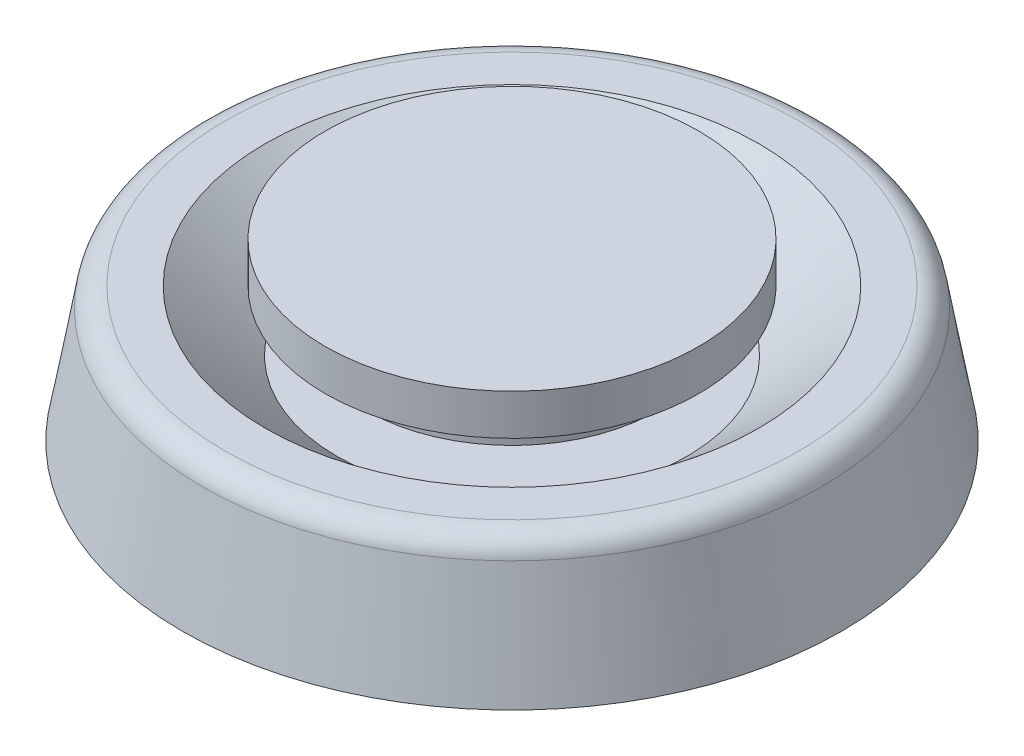
ISO-10303-21;
HEADER;
FILE_DESCRIPTION(('STEP AP214'),'2;1');
FILE_NAME('part.step','',(''),(''),'','','');
FILE_SCHEMA(('AUTOMOTIVE_DESIGN { 1 0 10303 214 1 1 1 1 }'));
ENDSEC;
DATA;
#1=APPLICATION_CONTEXT('core data for automotive mechanical design processes');
#2=APPLICATION_PROTOCOL_DEFINITION('international standard','automotive_design',2000,#1);
#3=PRODUCT_CONTEXT('',#1,'mechanical');
#4=PRODUCT('Part','Part','',(#3));
#5=PRODUCT_RELATED_PRODUCT_CATEGORY('part','',(#4));
#6=PRODUCT_DEFINITION_FORMATION('','',#4);
#7=PRODUCT_DEFINITION_CONTEXT('part definition',#1,'design');
#8=PRODUCT_DEFINITION('design','',#6,#7);
#9=PRODUCT_DEFINITION_SHAPE('','',#8);
#10=(LENGTH_UNIT() NAMED_UNIT(*) SI_UNIT(.MILLI.,.METRE.));
#11=(NAMED_UNIT(*) PLANE_ANGLE_UNIT() SI_UNIT($,.RADIAN.));
#12=(NAMED_UNIT(*) SI_UNIT($,.STERADIAN.) SOLID_ANGLE_UNIT());
#13=UNCERTAINTY_MEASURE_WITH_UNIT(LENGTH_MEASURE(1.E-05),#10,'distance_accuracy_value','');
#14=(GEOMETRIC_REPRESENTATION_CONTEXT(3) GLOBAL_UNCERTAINTY_ASSIGNED_CONTEXT((#13)) GLOBAL_UNIT_ASSIGNED_CONTEXT((#10,
#11,#12)) REPRESENTATION_CONTEXT('',''));
#15=CARTESIAN_POINT('',(0.,0.,0.));
#16=DIRECTION('',(0.,0.,1.));
#17=DIRECTION('',(1.,0.,0.));
#18=AXIS2_PLACEMENT_3D('',#15,#16,#17);
#19=CARTESIAN_POINT('',(-28.25,0.,0.));
#20=DIRECTION('',(0.,-1.,0.));
#21=DIRECTION('',(0.,0.,-1.));
#22=AXIS2_PLACEMENT_3D('',#19,#20,#21);
#23=PLANE('',#22);
#24=CARTESIAN_POINT('',(0.,0.,0.));
#25=DIRECTION('',(0.,1.,0.));
#26=DIRECTION('',(0.,0.,1.));
#27=AXIS2_PLACEMENT_3D('',#24,#25,#26);
#28=CIRCLE('',#27,28.25);
#29=CARTESIAN_POINT('',(0.,0.,28.25));
#30=VERTEX_POINT('',#29);
#31=EDGE_CURVE('E69',#30,#30,#28,.T.);
#32=ORIENTED_EDGE('',*,*,#31,.F.);
#33=EDGE_LOOP('',(#32));
#34=FACE_BOUND('',#33,.T.);
#35=ADVANCED_FACE('F32',(#34),#23,.T.);
#36=CARTESIAN_POINT('',(0.,15.,0.));
#37=DIRECTION('',(0.,1.,0.));
#38=DIRECTION('',(0.,0.,1.));
#39=AXIS2_PLACEMENT_3D('',#36,#37,#38);
#40=PLANE('',#39);
#41=CARTESIAN_POINT('',(0.,15.,0.));
#42=DIRECTION('',(0.,1.,0.));
#43=DIRECTION('',(0.,0.,1.));
#44=AXIS2_PLACEMENT_3D('',#41,#42,#43);
#45=CIRCLE('',#44,16.);
#46=CARTESIAN_POINT('',(0.,15.,16.));
#47=VERTEX_POINT('',#46);
#48=EDGE_CURVE('E10',#47,#47,#45,.T.);
#49=ORIENTED_EDGE('',*,*,#48,.T.);
#50=EDGE_LOOP('',(#49));
#51=FACE_BOUND('',#50,.T.);
#52=ADVANCED_FACE('F77',(#51),#40,.T.);
#53=CARTESIAN_POINT('',(0.,0.,0.));
#54=DIRECTION('',(0.,1.,0.));
#55=DIRECTION('',(0.,0.,1.));
#56=AXIS2_PLACEMENT_3D('',#53,#54,#55);
#57=CYLINDRICAL_SURFACE('',#56,16.);
#58=CARTESIAN_POINT('',(0.,11.5,0.));
#59=DIRECTION('',(0.,1.,0.));
#60=DIRECTION('',(0.,0.,1.));
#61=AXIS2_PLACEMENT_3D('',#58,#59,#60);
#62=CIRCLE('',#61,16.);
#63=CARTESIAN_POINT('',(0.,11.5,16.));
#64=VERTEX_POINT('',#63);
#65=EDGE_CURVE('E38',#64,#64,#62,.T.);
#66=ORIENTED_EDGE('',*,*,#65,.T.);
#67=EDGE_LOOP('',(#66));
#68=FACE_BOUND('',#67,.T.);
#69=ORIENTED_EDGE('',*,*,#48,.F.);
#70=EDGE_LOOP('',(#69));
#71=FACE_BOUND('',#70,.T.);
#72=ADVANCED_FACE('F81',(#68,#71),#57,.T.);
#73=CARTESIAN_POINT('',(-16.,11.5,0.));
#74=DIRECTION('',(0.,-1.,0.));
#75=DIRECTION('',(0.,0.,-1.));
#76=AXIS2_PLACEMENT_3D('',#73,#74,#75);
#77=PLANE('',#76);
#78=CARTESIAN_POINT('',(0.,11.5,0.));
#79=DIRECTION('',(0.,1.,0.));
#80=DIRECTION('',(0.,0.,1.));
#81=AXIS2_PLACEMENT_3D('',#78,#79,#80);
#82=CIRCLE('',#81,12.5);
#83=CARTESIAN_POINT('',(0.,11.5,12.5));
#84=VERTEX_POINT('',#83);
#85=EDGE_CURVE('E42',#84,#84,#82,.T.);
#86=ORIENTED_EDGE('',*,*,#85,.T.);
#87=EDGE_LOOP('',(#86));
#88=FACE_BOUND('',#87,.T.);
#89=ORIENTED_EDGE('',*,*,#65,.F.);
#90=EDGE_LOOP('',(#89));
#91=FACE_BOUND('',#90,.T.);
#92=ADVANCED_FACE('F85',(#88,#91),#77,.T.);
#93=CARTESIAN_POINT('',(0.,0.,0.));
#94=DIRECTION('',(0.,1.,0.));
#95=DIRECTION('',(0.,0.,1.));
#96=AXIS2_PLACEMENT_3D('',#93,#94,#95);
#97=CYLINDRICAL_SURFACE('',#96,12.5);
#98=CARTESIAN_POINT('',(0.,8.5,0.));
#99=DIRECTION('',(0.,1.,0.));
#100=DIRECTION('',(0.,0.,1.));
#101=AXIS2_PLACEMENT_3D('',#98,#99,#100);
#102=CIRCLE('',#101,12.5);
#103=CARTESIAN_POINT('',(0.,8.5,12.5));
#104=VERTEX_POINT('',#103);
#105=EDGE_CURVE('E46',#104,#104,#102,.T.);
#106=ORIENTED_EDGE('',*,*,#105,.T.);
#107=EDGE_LOOP('',(#106));
#108=FACE_BOUND('',#107,.T.);
#109=ORIENTED_EDGE('',*,*,#85,.F.);
#110=EDGE_LOOP('',(#109));
#111=FACE_BOUND('',#110,.T.);
#112=ADVANCED_FACE('F90',(#108,#111),#97,.T.);
#113=CARTESIAN_POINT('',(-12.5,8.5,0.));
#114=DIRECTION('',(0.,-1.,0.));
#115=DIRECTION('',(0.,0.,-1.));
#116=AXIS2_PLACEMENT_3D('',#113,#114,#115);
#117=PLANE('',#116);
#118=CARTESIAN_POINT('',(0.,8.5,0.));
#119=DIRECTION('',(0.,1.,0.));
#120=DIRECTION('',(0.,0.,1.));
#121=AXIS2_PLACEMENT_3D('',#118,#119,#120);
#122=CIRCLE('',#121,7.50000000000001);
#123=CARTESIAN_POINT('',(0.,8.5,7.50000000000001));
#124=VERTEX_POINT('',#123);
#125=EDGE_CURVE('E51',#124,#124,#122,.T.);
#126=ORIENTED_EDGE('',*,*,#125,.T.);
#127=EDGE_LOOP('',(#126));
#128=FACE_BOUND('',#127,.T.);
#129=ORIENTED_EDGE('',*,*,#105,.F.);
#130=EDGE_LOOP('',(#129));
#131=FACE_BOUND('',#130,.T.);
#132=ADVANCED_FACE('F94',(#128,#131),#117,.T.);
#133=CARTESIAN_POINT('',(0.,0.,0.));
#134=DIRECTION('',(0.,1.,0.));
#135=DIRECTION('',(0.,0.,1.));
#136=AXIS2_PLACEMENT_3D('',#133,#134,#135);
#137=CYLINDRICAL_SURFACE('',#136,7.50000000000001);
#138=CARTESIAN_POINT('',(0.,6.35483870967934,0.));
#139=DIRECTION('',(0.,1.,0.));
#140=DIRECTION('',(0.,0.,1.));
#141=AXIS2_PLACEMENT_3D('',#138,#139,#140);
#142=CIRCLE('',#141,7.50000000000001);
#143=CARTESIAN_POINT('',(0.,6.35483870967934,7.50000000000001));
#144=VERTEX_POINT('',#143);
#145=EDGE_CURVE('E54',#144,#144,#142,.T.);
#146=ORIENTED_EDGE('',*,*,#145,.T.);
#147=EDGE_LOOP('',(#146));
#148=FACE_BOUND('',#147,.T.);
#149=ORIENTED_EDGE('',*,*,#125,.F.);
#150=EDGE_LOOP('',(#149));
#151=FACE_BOUND('',#150,.T.);
#152=ADVANCED_FACE('F98',(#148,#151),#137,.T.);
#153=CARTESIAN_POINT('',(-7.50000000000001,6.35483870967934,0.));
#154=DIRECTION('',(0.,1.,0.));
#155=DIRECTION('',(0.,0.,1.));
#156=AXIS2_PLACEMENT_3D('',#153,#154,#155);
#157=PLANE('',#156);
#158=CARTESIAN_POINT('',(0.,6.35483870967934,0.));
#159=DIRECTION('',(0.,1.,0.));
#160=DIRECTION('',(0.,0.,1.));
#161=AXIS2_PLACEMENT_3D('',#158,#159,#160);
#162=CIRCLE('',#161,15.);
#163=CARTESIAN_POINT('',(0.,6.35483870967934,15.));
#164=VERTEX_POINT('',#163);
#165=EDGE_CURVE('E57',#164,#164,#162,.T.);
#166=ORIENTED_EDGE('',*,*,#165,.T.);
#167=EDGE_LOOP('',(#166));
#168=FACE_BOUND('',#167,.T.);
#169=ORIENTED_EDGE('',*,*,#145,.F.);
#170=EDGE_LOOP('',(#169));
#171=FACE_BOUND('',#170,.T.);
#172=ADVANCED_FACE('F102',(#168,#171),#157,.T.);
#173=CARTESIAN_POINT('',(0.,6.35483870967934,0.));
#174=DIRECTION('',(0.,1.,0.));
#175=DIRECTION('',(0.,0.,1.));
#176=AXIS2_PLACEMENT_3D('',#173,#174,#175);
#177=CONICAL_SURFACE('',#176,15.,0.872664625997164);
#178=CARTESIAN_POINT('',(0.,11.5,0.));
#179=DIRECTION('',(0.,1.,0.));
#180=DIRECTION('',(0.,0.,1.));
#181=AXIS2_PLACEMENT_3D('',#178,#179,#180);
#182=CIRCLE('',#181,21.1317644522163);
#183=CARTESIAN_POINT('',(0.,11.5,21.1317644522163));
#184=VERTEX_POINT('',#183);
#185=EDGE_CURVE('E60',#184,#184,#182,.T.);
#186=ORIENTED_EDGE('',*,*,#185,.T.);
#187=EDGE_LOOP('',(#186));
#188=FACE_BOUND('',#187,.T.);
#189=ORIENTED_EDGE('',*,*,#165,.F.);
#190=EDGE_LOOP('',(#189));
#191=FACE_BOUND('',#190,.T.);
#192=ADVANCED_FACE('F106',(#188,#191),#177,.F.);
#193=CARTESIAN_POINT('',(-21.1317644522163,11.5,0.));
#194=DIRECTION('',(0.,1.,0.));
#195=DIRECTION('',(0.,0.,1.));
#196=AXIS2_PLACEMENT_3D('',#193,#194,#195);
#197=PLANE('',#196);
#198=CARTESIAN_POINT('',(0.,11.5,0.));
#199=DIRECTION('',(0.,1.,0.));
#200=DIRECTION('',(0.,0.,1.));
#201=AXIS2_PLACEMENT_3D('',#198,#199,#200);
#202=CIRCLE('',#201,24.544040459498);
#203=CARTESIAN_POINT('',(0.,11.5,24.544040459498));
#204=VERTEX_POINT('',#203);
#205=EDGE_CURVE('E63',#204,#204,#202,.T.);
#206=ORIENTED_EDGE('',*,*,#205,.T.);
#207=EDGE_LOOP('',(#206));
#208=FACE_BOUND('',#207,.T.);
#209=ORIENTED_EDGE('',*,*,#185,.F.);
#210=EDGE_LOOP('',(#209));
#211=FACE_BOUND('',#210,.T.);
#212=ADVANCED_FACE('F110',(#208,#211),#197,.T.);
#213=CARTESIAN_POINT('',(0.,9.5,0.));
#214=DIRECTION('',(0.,1.,0.));
#215=DIRECTION('',(0.,0.,1.));
#216=AXIS2_PLACEMENT_3D('',#213,#214,#215);
#217=TOROIDAL_SURFACE('',#216,24.5440404594981,2.);
#218=CARTESIAN_POINT('',(0.,9.84729635533386,0.));
#219=DIRECTION('',(0.,1.,0.));
#220=DIRECTION('',(0.,0.,1.));
#221=AXIS2_PLACEMENT_3D('',#218,#219,#220);
#222=CIRCLE('',#221,26.5136559655225);
#223=CARTESIAN_POINT('',(0.,9.84729635533386,26.5136559655225));
#224=VERTEX_POINT('',#223);
#225=EDGE_CURVE('E66',#224,#224,#222,.T.);
#226=ORIENTED_EDGE('',*,*,#225,.T.);
#227=EDGE_LOOP('',(#226));
#228=FACE_BOUND('',#227,.T.);
#229=ORIENTED_EDGE('',*,*,#205,.F.);
#230=EDGE_LOOP('',(#229));
#231=FACE_BOUND('',#230,.T.);
#232=ADVANCED_FACE('F114',(#228,#231),#217,.T.);
#233=CARTESIAN_POINT('',(0.,9.84729635533386,0.));
#234=DIRECTION('',(0.,-1.,0.));
#235=DIRECTION('',(0.,0.,-1.));
#236=AXIS2_PLACEMENT_3D('',#233,#234,#235);
#237=CONICAL_SURFACE('',#236,26.5136559655225,0.174532925199437);
#238=ORIENTED_EDGE('',*,*,#31,.T.);
#239=EDGE_LOOP('',(#238));
#240=FACE_BOUND('',#239,.T.);
#241=ORIENTED_EDGE('',*,*,#225,.F.);
#242=EDGE_LOOP('',(#241));
#243=FACE_BOUND('',#242,.T.);
#244=ADVANCED_FACE('F73',(#240,#243),#237,.T.);
#245=CLOSED_SHELL('',(#35,#52,#72,#92,#112,#132,#152,#172,#192,#212,#232,#244));
#246=MANIFOLD_SOLID_BREP('B2',#245);
#247=ADVANCED_BREP_SHAPE_REPRESENTATION('',(#18,#246),#14);
#248=SHAPE_DEFINITION_REPRESENTATION(#9,#247);
ENDSEC;
END-ISO-10303-21;
